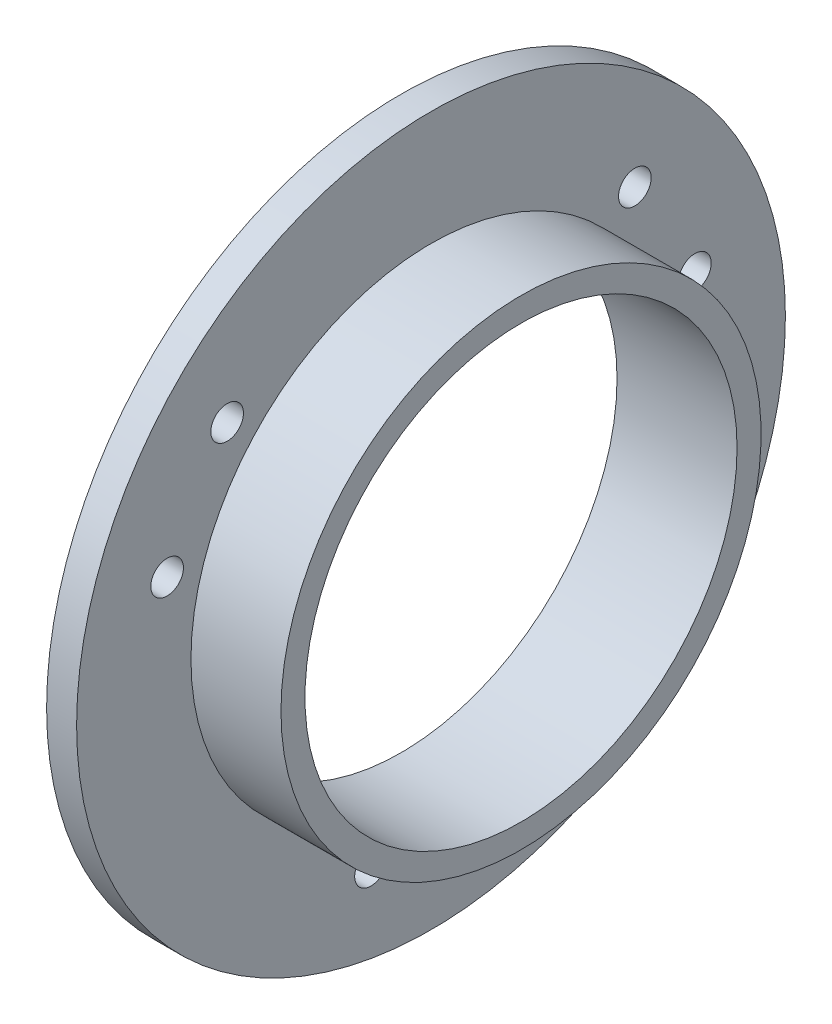
ISO-10303-21;
HEADER;
FILE_DESCRIPTION(('STEP AP214'),'2;1');
FILE_NAME('part.step','',(''),(''),'','','');
FILE_SCHEMA(('AUTOMOTIVE_DESIGN { 1 0 10303 214 1 1 1 1 }'));
ENDSEC;
DATA;
#1=APPLICATION_CONTEXT('core data for automotive mechanical design processes');
#2=APPLICATION_PROTOCOL_DEFINITION('international standard','automotive_design',2000,#1);
#3=PRODUCT_CONTEXT('',#1,'mechanical');
#4=PRODUCT('Part','Part','',(#3));
#5=PRODUCT_RELATED_PRODUCT_CATEGORY('part','',(#4));
#6=PRODUCT_DEFINITION_FORMATION('','',#4);
#7=PRODUCT_DEFINITION_CONTEXT('part definition',#1,'design');
#8=PRODUCT_DEFINITION('design','',#6,#7);
#9=PRODUCT_DEFINITION_SHAPE('','',#8);
#10=(LENGTH_UNIT() NAMED_UNIT(*) SI_UNIT(.MILLI.,.METRE.));
#11=(NAMED_UNIT(*) PLANE_ANGLE_UNIT() SI_UNIT($,.RADIAN.));
#12=(NAMED_UNIT(*) SI_UNIT($,.STERADIAN.) SOLID_ANGLE_UNIT());
#13=UNCERTAINTY_MEASURE_WITH_UNIT(LENGTH_MEASURE(1.E-05),#10,'distance_accuracy_value','');
#14=(GEOMETRIC_REPRESENTATION_CONTEXT(3) GLOBAL_UNCERTAINTY_ASSIGNED_CONTEXT((#13)) GLOBAL_UNIT_ASSIGNED_CONTEXT((#10,
#11,#12)) REPRESENTATION_CONTEXT('',''));
#15=CARTESIAN_POINT('',(0.,0.,0.));
#16=DIRECTION('',(0.,0.,1.));
#17=DIRECTION('',(1.,0.,0.));
#18=AXIS2_PLACEMENT_3D('',#15,#16,#17);
#19=CARTESIAN_POINT('',(3.175,0.,0.));
#20=DIRECTION('',(1.,0.,0.));
#21=DIRECTION('',(0.,0.,-1.));
#22=AXIS2_PLACEMENT_3D('',#19,#20,#21);
#23=PLANE('',#22);
#24=CARTESIAN_POINT('',(3.175,-28.5749999999992,-6.35000000000374));
#25=DIRECTION('',(1.,0.,0.));
#26=DIRECTION('',(0.,0.,-1.));
#27=AXIS2_PLACEMENT_3D('',#24,#25,#26);
#28=CIRCLE('',#27,1.72720000000023);
#29=CARTESIAN_POINT('',(3.175,-28.5749999999992,-8.07720000000397));
#30=VERTEX_POINT('',#29);
#31=EDGE_CURVE('E82',#30,#30,#28,.T.);
#32=ORIENTED_EDGE('',*,*,#31,.F.);
#33=EDGE_LOOP('',(#32));
#34=FACE_BOUND('',#33,.T.);
#35=CARTESIAN_POINT('',(3.175,8.78823868596868,27.9216759131407));
#36=DIRECTION('',(1.,0.,0.));
#37=DIRECTION('',(0.,0.,-1.));
#38=AXIS2_PLACEMENT_3D('',#35,#36,#37);
#39=CIRCLE('',#38,1.72720000000033);
#40=CARTESIAN_POINT('',(3.175,8.78823868596868,26.1944759131403));
#41=VERTEX_POINT('',#40);
#42=EDGE_CURVE('E70',#41,#41,#39,.T.);
#43=ORIENTED_EDGE('',*,*,#42,.F.);
#44=EDGE_LOOP('',(#43));
#45=FACE_BOUND('',#44,.T.);
#46=CARTESIAN_POINT('',(3.175,19.7867613140311,-21.5716759131415));
#47=DIRECTION('',(1.,0.,0.));
#48=DIRECTION('',(0.,0.,-1.));
#49=AXIS2_PLACEMENT_3D('',#46,#47,#48);
#50=CIRCLE('',#49,1.72720000000133);
#51=CARTESIAN_POINT('',(3.175,19.7867613140311,-23.2988759131428));
#52=VERTEX_POINT('',#51);
#53=EDGE_CURVE('E58',#52,#52,#50,.T.);
#54=ORIENTED_EDGE('',*,*,#53,.F.);
#55=EDGE_LOOP('',(#54));
#56=FACE_BOUND('',#55,.T.);
#57=CARTESIAN_POINT('',(3.175,0.,0.));
#58=DIRECTION('',(1.,0.,0.));
#59=DIRECTION('',(0.,0.,-1.));
#60=AXIS2_PLACEMENT_3D('',#57,#58,#59);
#61=CIRCLE('',#60,37.5);
#62=CARTESIAN_POINT('',(3.175,0.,-37.5));
#63=VERTEX_POINT('',#62);
#64=EDGE_CURVE('E10',#63,#63,#61,.T.);
#65=ORIENTED_EDGE('',*,*,#64,.T.);
#66=EDGE_LOOP('',(#65));
#67=FACE_BOUND('',#66,.T.);
#68=CARTESIAN_POINT('',(3.175,8.78823868596868,-27.9216759131415));
#69=DIRECTION('',(1.,0.,0.));
#70=DIRECTION('',(0.,0.,-1.));
#71=AXIS2_PLACEMENT_3D('',#68,#69,#70);
#72=CIRCLE('',#71,1.72720000000126);
#73=CARTESIAN_POINT('',(3.175,8.78823868596868,-29.6488759131428));
#74=VERTEX_POINT('',#73);
#75=EDGE_CURVE('E54',#74,#74,#72,.T.);
#76=ORIENTED_EDGE('',*,*,#75,.F.);
#77=EDGE_LOOP('',(#76));
#78=FACE_BOUND('',#77,.T.);
#79=CARTESIAN_POINT('',(3.175,19.7867613140311,21.5716759131405));
#80=DIRECTION('',(1.,0.,0.));
#81=DIRECTION('',(0.,0.,-1.));
#82=AXIS2_PLACEMENT_3D('',#79,#80,#81);
#83=CIRCLE('',#82,1.72720000000009);
#84=CARTESIAN_POINT('',(3.175,19.7867613140311,19.8444759131404));
#85=VERTEX_POINT('',#84);
#86=EDGE_CURVE('E64',#85,#85,#83,.T.);
#87=ORIENTED_EDGE('',*,*,#86,.F.);
#88=EDGE_LOOP('',(#87));
#89=FACE_BOUND('',#88,.T.);
#90=CARTESIAN_POINT('',(3.175,-28.5749999999992,6.34999999999597));
#91=DIRECTION('',(1.,0.,0.));
#92=DIRECTION('',(0.,0.,-1.));
#93=AXIS2_PLACEMENT_3D('',#90,#91,#92);
#94=CIRCLE('',#93,1.72719999999998);
#95=CARTESIAN_POINT('',(3.175,-28.5749999999992,4.62279999999599));
#96=VERTEX_POINT('',#95);
#97=EDGE_CURVE('E76',#96,#96,#94,.T.);
#98=ORIENTED_EDGE('',*,*,#97,.F.);
#99=EDGE_LOOP('',(#98));
#100=FACE_BOUND('',#99,.T.);
#101=CARTESIAN_POINT('',(3.175,0.,0.));
#102=DIRECTION('',(1.,0.,0.));
#103=DIRECTION('',(0.,0.,-1.));
#104=AXIS2_PLACEMENT_3D('',#101,#102,#103);
#105=CIRCLE('',#104,25.4);
#106=CARTESIAN_POINT('',(3.175,0.,25.4));
#107=VERTEX_POINT('',#106);
#108=EDGE_CURVE('E91',#107,#107,#105,.T.);
#109=ORIENTED_EDGE('',*,*,#108,.F.);
#110=EDGE_LOOP('',(#109));
#111=FACE_BOUND('',#110,.T.);
#112=ADVANCED_FACE('F39',(#34,#45,#56,#67,#78,#89,#100,#111),#23,.T.);
#113=CARTESIAN_POINT('',(0.,0.,0.));
#114=DIRECTION('',(1.,0.,0.));
#115=DIRECTION('',(0.,0.,-1.));
#116=AXIS2_PLACEMENT_3D('',#113,#114,#115);
#117=PLANE('',#116);
#118=CARTESIAN_POINT('',(0.,0.,0.));
#119=DIRECTION('',(1.,0.,0.));
#120=DIRECTION('',(0.,0.,-1.));
#121=AXIS2_PLACEMENT_3D('',#118,#119,#120);
#122=CIRCLE('',#121,37.5);
#123=CARTESIAN_POINT('',(0.,0.,-37.5));
#124=VERTEX_POINT('',#123);
#125=EDGE_CURVE('E43',#124,#124,#122,.T.);
#126=ORIENTED_EDGE('',*,*,#125,.F.);
#127=EDGE_LOOP('',(#126));
#128=FACE_BOUND('',#127,.T.);
#129=CARTESIAN_POINT('',(0.,0.,0.));
#130=DIRECTION('',(1.,0.,0.));
#131=DIRECTION('',(0.,0.,-1.));
#132=AXIS2_PLACEMENT_3D('',#129,#130,#131);
#133=CIRCLE('',#132,22.86);
#134=CARTESIAN_POINT('',(0.,0.,-22.86));
#135=VERTEX_POINT('',#134);
#136=EDGE_CURVE('E50',#135,#135,#133,.T.);
#137=ORIENTED_EDGE('',*,*,#136,.T.);
#138=EDGE_LOOP('',(#137));
#139=FACE_BOUND('',#138,.T.);
#140=CARTESIAN_POINT('',(0.,8.78823868596868,-27.9216759131415));
#141=DIRECTION('',(1.,0.,0.));
#142=DIRECTION('',(0.,0.,-1.));
#143=AXIS2_PLACEMENT_3D('',#140,#141,#142);
#144=CIRCLE('',#143,1.72720000000126);
#145=CARTESIAN_POINT('',(0.,8.78823868596868,-29.6488759131428));
#146=VERTEX_POINT('',#145);
#147=EDGE_CURVE('E55',#146,#146,#144,.T.);
#148=ORIENTED_EDGE('',*,*,#147,.T.);
#149=EDGE_LOOP('',(#148));
#150=FACE_BOUND('',#149,.T.);
#151=CARTESIAN_POINT('',(0.,19.7867613140311,-21.5716759131415));
#152=DIRECTION('',(1.,0.,0.));
#153=DIRECTION('',(0.,0.,-1.));
#154=AXIS2_PLACEMENT_3D('',#151,#152,#153);
#155=CIRCLE('',#154,1.72720000000133);
#156=CARTESIAN_POINT('',(0.,19.7867613140311,-23.2988759131428));
#157=VERTEX_POINT('',#156);
#158=EDGE_CURVE('E61',#157,#157,#155,.T.);
#159=ORIENTED_EDGE('',*,*,#158,.T.);
#160=EDGE_LOOP('',(#159));
#161=FACE_BOUND('',#160,.T.);
#162=CARTESIAN_POINT('',(0.,19.7867613140311,21.5716759131405));
#163=DIRECTION('',(1.,0.,0.));
#164=DIRECTION('',(0.,0.,-1.));
#165=AXIS2_PLACEMENT_3D('',#162,#163,#164);
#166=CIRCLE('',#165,1.72720000000009);
#167=CARTESIAN_POINT('',(0.,19.7867613140311,19.8444759131404));
#168=VERTEX_POINT('',#167);
#169=EDGE_CURVE('E67',#168,#168,#166,.T.);
#170=ORIENTED_EDGE('',*,*,#169,.T.);
#171=EDGE_LOOP('',(#170));
#172=FACE_BOUND('',#171,.T.);
#173=CARTESIAN_POINT('',(0.,8.78823868596868,27.9216759131407));
#174=DIRECTION('',(1.,0.,0.));
#175=DIRECTION('',(0.,0.,-1.));
#176=AXIS2_PLACEMENT_3D('',#173,#174,#175);
#177=CIRCLE('',#176,1.72720000000033);
#178=CARTESIAN_POINT('',(0.,8.78823868596868,26.1944759131403));
#179=VERTEX_POINT('',#178);
#180=EDGE_CURVE('E73',#179,#179,#177,.T.);
#181=ORIENTED_EDGE('',*,*,#180,.T.);
#182=EDGE_LOOP('',(#181));
#183=FACE_BOUND('',#182,.T.);
#184=CARTESIAN_POINT('',(0.,-28.5749999999992,6.34999999999597));
#185=DIRECTION('',(1.,0.,0.));
#186=DIRECTION('',(0.,0.,-1.));
#187=AXIS2_PLACEMENT_3D('',#184,#185,#186);
#188=CIRCLE('',#187,1.72719999999998);
#189=CARTESIAN_POINT('',(0.,-28.5749999999992,4.62279999999599));
#190=VERTEX_POINT('',#189);
#191=EDGE_CURVE('E79',#190,#190,#188,.T.);
#192=ORIENTED_EDGE('',*,*,#191,.T.);
#193=EDGE_LOOP('',(#192));
#194=FACE_BOUND('',#193,.T.);
#195=CARTESIAN_POINT('',(0.,-28.5749999999992,-6.35000000000374));
#196=DIRECTION('',(1.,0.,0.));
#197=DIRECTION('',(0.,0.,-1.));
#198=AXIS2_PLACEMENT_3D('',#195,#196,#197);
#199=CIRCLE('',#198,1.72720000000023);
#200=CARTESIAN_POINT('',(0.,-28.5749999999992,-8.07720000000397));
#201=VERTEX_POINT('',#200);
#202=EDGE_CURVE('E85',#201,#201,#199,.T.);
#203=ORIENTED_EDGE('',*,*,#202,.T.);
#204=EDGE_LOOP('',(#203));
#205=FACE_BOUND('',#204,.T.);
#206=ADVANCED_FACE('F119',(#128,#139,#150,#161,#172,#183,#194,#205),#117,.F.);
#207=CARTESIAN_POINT('',(3.175,0.,0.));
#208=DIRECTION('',(-1.,0.,0.));
#209=DIRECTION('',(0.,0.,1.));
#210=AXIS2_PLACEMENT_3D('',#207,#208,#209);
#211=CYLINDRICAL_SURFACE('',#210,37.5);
#212=ORIENTED_EDGE('',*,*,#64,.F.);
#213=EDGE_LOOP('',(#212));
#214=FACE_BOUND('',#213,.T.);
#215=ORIENTED_EDGE('',*,*,#125,.T.);
#216=EDGE_LOOP('',(#215));
#217=FACE_BOUND('',#216,.T.);
#218=ADVANCED_FACE('F41',(#214,#217),#211,.T.);
#219=CARTESIAN_POINT('',(3.175,0.,0.));
#220=DIRECTION('',(-1.,0.,0.));
#221=DIRECTION('',(0.,0.,1.));
#222=AXIS2_PLACEMENT_3D('',#219,#220,#221);
#223=CYLINDRICAL_SURFACE('',#222,22.86);
#224=ORIENTED_EDGE('',*,*,#136,.F.);
#225=EDGE_LOOP('',(#224));
#226=FACE_BOUND('',#225,.T.);
#227=CARTESIAN_POINT('',(12.7,0.,0.));
#228=DIRECTION('',(1.,0.,0.));
#229=DIRECTION('',(0.,0.,-1.));
#230=AXIS2_PLACEMENT_3D('',#227,#228,#229);
#231=CIRCLE('',#230,22.86);
#232=CARTESIAN_POINT('',(12.7,0.,-22.86));
#233=VERTEX_POINT('',#232);
#234=EDGE_CURVE('E94',#233,#233,#231,.T.);
#235=ORIENTED_EDGE('',*,*,#234,.T.);
#236=EDGE_LOOP('',(#235));
#237=FACE_BOUND('',#236,.T.);
#238=ADVANCED_FACE('F100',(#226,#237),#223,.F.);
#239=CARTESIAN_POINT('',(3.175,8.78823868596868,-27.9216759131415));
#240=DIRECTION('',(-1.,0.,0.));
#241=DIRECTION('',(0.,0.,1.));
#242=AXIS2_PLACEMENT_3D('',#239,#240,#241);
#243=CYLINDRICAL_SURFACE('',#242,1.72720000000126);
#244=ORIENTED_EDGE('',*,*,#75,.T.);
#245=EDGE_LOOP('',(#244));
#246=FACE_BOUND('',#245,.T.);
#247=ORIENTED_EDGE('',*,*,#147,.F.);
#248=EDGE_LOOP('',(#247));
#249=FACE_BOUND('',#248,.T.);
#250=ADVANCED_FACE('F130',(#246,#249),#243,.F.);
#251=CARTESIAN_POINT('',(3.175,19.7867613140311,-21.5716759131415));
#252=DIRECTION('',(-1.,0.,0.));
#253=DIRECTION('',(0.,0.,1.));
#254=AXIS2_PLACEMENT_3D('',#251,#252,#253);
#255=CYLINDRICAL_SURFACE('',#254,1.72720000000133);
#256=ORIENTED_EDGE('',*,*,#53,.T.);
#257=EDGE_LOOP('',(#256));
#258=FACE_BOUND('',#257,.T.);
#259=ORIENTED_EDGE('',*,*,#158,.F.);
#260=EDGE_LOOP('',(#259));
#261=FACE_BOUND('',#260,.T.);
#262=ADVANCED_FACE('F134',(#258,#261),#255,.F.);
#263=CARTESIAN_POINT('',(3.175,19.7867613140311,21.5716759131405));
#264=DIRECTION('',(-1.,0.,0.));
#265=DIRECTION('',(0.,0.,1.));
#266=AXIS2_PLACEMENT_3D('',#263,#264,#265);
#267=CYLINDRICAL_SURFACE('',#266,1.72720000000009);
#268=ORIENTED_EDGE('',*,*,#86,.T.);
#269=EDGE_LOOP('',(#268));
#270=FACE_BOUND('',#269,.T.);
#271=ORIENTED_EDGE('',*,*,#169,.F.);
#272=EDGE_LOOP('',(#271));
#273=FACE_BOUND('',#272,.T.);
#274=ADVANCED_FACE('F138',(#270,#273),#267,.F.);
#275=CARTESIAN_POINT('',(3.175,8.78823868596868,27.9216759131407));
#276=DIRECTION('',(-1.,0.,0.));
#277=DIRECTION('',(0.,0.,1.));
#278=AXIS2_PLACEMENT_3D('',#275,#276,#277);
#279=CYLINDRICAL_SURFACE('',#278,1.72720000000033);
#280=ORIENTED_EDGE('',*,*,#42,.T.);
#281=EDGE_LOOP('',(#280));
#282=FACE_BOUND('',#281,.T.);
#283=ORIENTED_EDGE('',*,*,#180,.F.);
#284=EDGE_LOOP('',(#283));
#285=FACE_BOUND('',#284,.T.);
#286=ADVANCED_FACE('F142',(#282,#285),#279,.F.);
#287=CARTESIAN_POINT('',(3.175,-28.5749999999992,6.34999999999597));
#288=DIRECTION('',(-1.,0.,0.));
#289=DIRECTION('',(0.,0.,1.));
#290=AXIS2_PLACEMENT_3D('',#287,#288,#289);
#291=CYLINDRICAL_SURFACE('',#290,1.72719999999998);
#292=ORIENTED_EDGE('',*,*,#97,.T.);
#293=EDGE_LOOP('',(#292));
#294=FACE_BOUND('',#293,.T.);
#295=ORIENTED_EDGE('',*,*,#191,.F.);
#296=EDGE_LOOP('',(#295));
#297=FACE_BOUND('',#296,.T.);
#298=ADVANCED_FACE('F115',(#294,#297),#291,.F.);
#299=CARTESIAN_POINT('',(3.175,-28.5749999999992,-6.35000000000374));
#300=DIRECTION('',(-1.,0.,0.));
#301=DIRECTION('',(0.,0.,1.));
#302=AXIS2_PLACEMENT_3D('',#299,#300,#301);
#303=CYLINDRICAL_SURFACE('',#302,1.72720000000023);
#304=ORIENTED_EDGE('',*,*,#31,.T.);
#305=EDGE_LOOP('',(#304));
#306=FACE_BOUND('',#305,.T.);
#307=ORIENTED_EDGE('',*,*,#202,.F.);
#308=EDGE_LOOP('',(#307));
#309=FACE_BOUND('',#308,.T.);
#310=ADVANCED_FACE('F105',(#306,#309),#303,.F.);
#311=CARTESIAN_POINT('',(12.7,0.,0.));
#312=DIRECTION('',(1.,0.,0.));
#313=DIRECTION('',(0.,0.,-1.));
#314=AXIS2_PLACEMENT_3D('',#311,#312,#313);
#315=PLANE('',#314);
#316=CARTESIAN_POINT('',(12.7,0.,0.));
#317=DIRECTION('',(1.,0.,0.));
#318=DIRECTION('',(0.,0.,-1.));
#319=AXIS2_PLACEMENT_3D('',#316,#317,#318);
#320=CIRCLE('',#319,25.4);
#321=CARTESIAN_POINT('',(12.7,0.,25.4));
#322=VERTEX_POINT('',#321);
#323=EDGE_CURVE('E88',#322,#322,#320,.T.);
#324=ORIENTED_EDGE('',*,*,#323,.T.);
#325=EDGE_LOOP('',(#324));
#326=FACE_BOUND('',#325,.T.);
#327=ORIENTED_EDGE('',*,*,#234,.F.);
#328=EDGE_LOOP('',(#327));
#329=FACE_BOUND('',#328,.T.);
#330=ADVANCED_FACE('F102',(#326,#329),#315,.T.);
#331=CARTESIAN_POINT('',(12.7,0.,0.));
#332=DIRECTION('',(-1.,0.,0.));
#333=DIRECTION('',(0.,0.,1.));
#334=AXIS2_PLACEMENT_3D('',#331,#332,#333);
#335=CYLINDRICAL_SURFACE('',#334,25.4);
#336=CARTESIAN_POINT('',(12.7,0.,25.4));
#337=CARTESIAN_POINT('',(12.60078125,0.,25.4));
#338=CARTESIAN_POINT('',(12.5015625,0.,25.4));
#339=CARTESIAN_POINT('',(12.303125,0.,25.4));
#340=CARTESIAN_POINT('',(12.20390625,0.,25.4));
#341=CARTESIAN_POINT('',(12.00546875,0.,25.4));
#342=CARTESIAN_POINT('',(11.90625,0.,25.4));
#343=CARTESIAN_POINT('',(11.7078125,0.,25.4));
#344=CARTESIAN_POINT('',(11.60859375,0.,25.4));
#345=CARTESIAN_POINT('',(11.41015625,0.,25.4));
#346=CARTESIAN_POINT('',(11.3109375,0.,25.4));
#347=CARTESIAN_POINT('',(11.1125,0.,25.4));
#348=CARTESIAN_POINT('',(11.01328125,0.,25.4));
#349=CARTESIAN_POINT('',(10.81484375,0.,25.4));
#350=CARTESIAN_POINT('',(10.715625,0.,25.4));
#351=CARTESIAN_POINT('',(10.5171875,0.,25.4));
#352=CARTESIAN_POINT('',(10.41796875,0.,25.4));
#353=CARTESIAN_POINT('',(10.21953125,0.,25.4));
#354=CARTESIAN_POINT('',(10.1203125,0.,25.4));
#355=CARTESIAN_POINT('',(9.921875,0.,25.4));
#356=CARTESIAN_POINT('',(9.82265625,0.,25.4));
#357=CARTESIAN_POINT('',(9.62421875,0.,25.4));
#358=CARTESIAN_POINT('',(9.525,0.,25.4));
#359=CARTESIAN_POINT('',(9.3265625,0.,25.4));
#360=CARTESIAN_POINT('',(9.22734375,0.,25.4));
#361=CARTESIAN_POINT('',(9.02890625,0.,25.4));
#362=CARTESIAN_POINT('',(8.9296875,0.,25.4));
#363=CARTESIAN_POINT('',(8.73125,0.,25.4));
#364=CARTESIAN_POINT('',(8.63203125,0.,25.4));
#365=CARTESIAN_POINT('',(8.43359375,0.,25.4));
#366=CARTESIAN_POINT('',(8.334375,0.,25.4));
#367=CARTESIAN_POINT('',(8.1359375,0.,25.4));
#368=CARTESIAN_POINT('',(8.03671875,0.,25.4));
#369=CARTESIAN_POINT('',(7.83828125,0.,25.4));
#370=CARTESIAN_POINT('',(7.7390625,0.,25.4));
#371=CARTESIAN_POINT('',(7.540625,0.,25.4));
#372=CARTESIAN_POINT('',(7.44140625,0.,25.4));
#373=CARTESIAN_POINT('',(7.24296875,0.,25.4));
#374=CARTESIAN_POINT('',(7.14375,0.,25.4));
#375=CARTESIAN_POINT('',(6.9453125,0.,25.4));
#376=CARTESIAN_POINT('',(6.84609375,0.,25.4));
#377=CARTESIAN_POINT('',(6.64765625,0.,25.4));
#378=CARTESIAN_POINT('',(6.5484375,0.,25.4));
#379=CARTESIAN_POINT('',(6.35,0.,25.4));
#380=CARTESIAN_POINT('',(6.25078125,0.,25.4));
#381=CARTESIAN_POINT('',(6.05234375,0.,25.4));
#382=CARTESIAN_POINT('',(5.953125,0.,25.4));
#383=CARTESIAN_POINT('',(5.7546875,0.,25.4));
#384=CARTESIAN_POINT('',(5.65546875,0.,25.4));
#385=CARTESIAN_POINT('',(5.45703125,0.,25.4));
#386=CARTESIAN_POINT('',(5.3578125,0.,25.4));
#387=CARTESIAN_POINT('',(5.159375,0.,25.4));
#388=CARTESIAN_POINT('',(5.06015625,0.,25.4));
#389=CARTESIAN_POINT('',(4.86171875,0.,25.4));
#390=CARTESIAN_POINT('',(4.7625,0.,25.4));
#391=CARTESIAN_POINT('',(4.5640625,0.,25.4));
#392=CARTESIAN_POINT('',(4.46484375,0.,25.4));
#393=CARTESIAN_POINT('',(4.26640625,0.,25.4));
#394=CARTESIAN_POINT('',(4.1671875,0.,25.4));
#395=CARTESIAN_POINT('',(3.96875,0.,25.4));
#396=CARTESIAN_POINT('',(3.86953125,0.,25.4));
#397=CARTESIAN_POINT('',(3.67109375,0.,25.4));
#398=CARTESIAN_POINT('',(3.571875,0.,25.4));
#399=CARTESIAN_POINT('',(3.3734375,0.,25.4));
#400=CARTESIAN_POINT('',(3.27421875,0.,25.4));
#401=CARTESIAN_POINT('',(3.175,0.,25.4));
#402=B_SPLINE_CURVE_WITH_KNOTS('',3,(#336,#337,#338,#339,#340,#341,#342,#343,#344,#345,#346,
#347,#348,#349,#350,#351,#352,#353,#354,#355,#356,#357,#358,#359,#360,#361,#362,#363,#364,#365,
#366,#367,#368,#369,#370,#371,#372,#373,#374,#375,#376,#377,#378,#379,#380,#381,#382,#383,#384,
#385,#386,#387,#388,#389,#390,#391,#392,#393,#394,#395,#396,#397,#398,#399,#400,#401),
.UNSPECIFIED.,.F.,.F.,(4,2,2,2,2,2,2,2,2,2,2,2,2,2,2,2,2,2,2,2,2,2,2,2,2,2,2,2,2,2,2,2,4),(0.,
0.297656249999998,0.595312499999999,0.892968749999999,1.190625,1.48828125,1.7859375,2.08359375,
2.38125,2.67890625,2.9765625,3.27421875,3.571875,3.86953125,4.1671875,4.46484375,4.7625,
5.06015625,5.3578125,5.65546875,5.953125,6.25078125,6.5484375,6.84609375,7.14375,7.44140625,
7.7390625,8.03671875,8.334375,8.63203125,8.9296875,9.22734375,9.525),.UNSPECIFIED.);
#403=EDGE_CURVE('BSEAM104',#322,#107,#402,.T.);
#404=ORIENTED_EDGE('',*,*,#323,.F.);
#405=ORIENTED_EDGE('',*,*,#108,.T.);
#406=ORIENTED_EDGE('',*,*,#403,.T.);
#407=ORIENTED_EDGE('',*,*,#403,.F.);
#408=EDGE_LOOP('',(#404,#406,#405,#407));
#409=FACE_BOUND('',#408,.T.);
#410=ADVANCED_FACE('F104',(#409),#335,.T.);
#411=CLOSED_SHELL('',(#112,#206,#218,#238,#250,#262,#274,#286,#298,#310,#330,#410));
#412=MANIFOLD_SOLID_BREP('B2',#411);
#413=ADVANCED_BREP_SHAPE_REPRESENTATION('',(#18,#412),#14);
#414=SHAPE_DEFINITION_REPRESENTATION(#9,#413);
ENDSEC;
END-ISO-10303-21;
